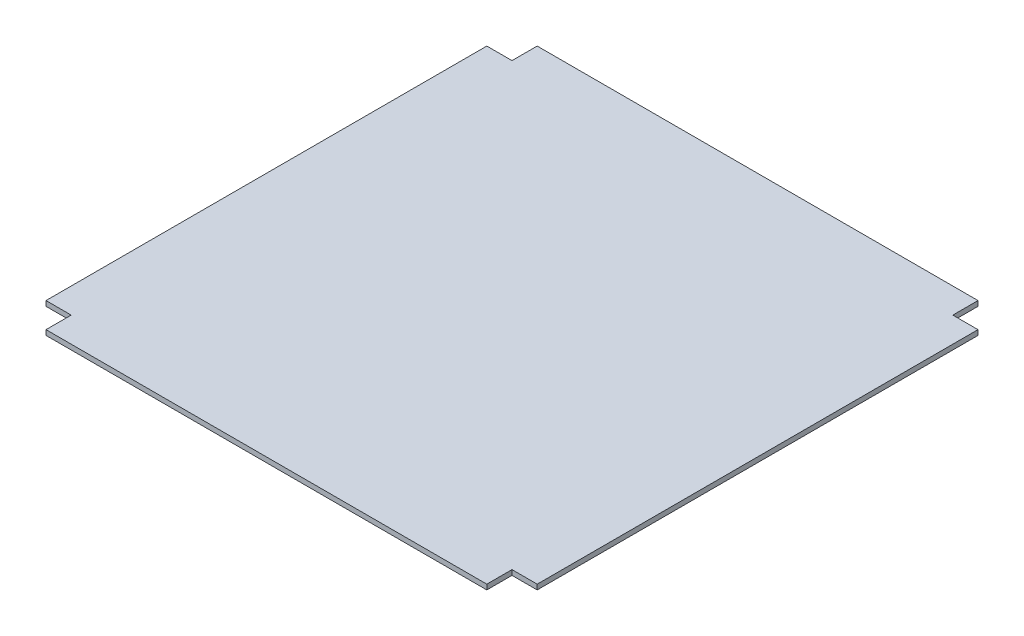
ISO-10303-21;
HEADER;
FILE_DESCRIPTION(('STEP AP214'),'2;1');
FILE_NAME('part.step','',(''),(''),'','','');
FILE_SCHEMA(('AUTOMOTIVE_DESIGN { 1 0 10303 214 1 1 1 1 }'));
ENDSEC;
DATA;
#1=APPLICATION_CONTEXT('core data for automotive mechanical design processes');
#2=APPLICATION_PROTOCOL_DEFINITION('international standard','automotive_design',2000,#1);
#3=PRODUCT_CONTEXT('',#1,'mechanical');
#4=PRODUCT('Part','Part','',(#3));
#5=PRODUCT_RELATED_PRODUCT_CATEGORY('part','',(#4));
#6=PRODUCT_DEFINITION_FORMATION('','',#4);
#7=PRODUCT_DEFINITION_CONTEXT('part definition',#1,'design');
#8=PRODUCT_DEFINITION('design','',#6,#7);
#9=PRODUCT_DEFINITION_SHAPE('','',#8);
#10=(LENGTH_UNIT() NAMED_UNIT(*) SI_UNIT(.MILLI.,.METRE.));
#11=(NAMED_UNIT(*) PLANE_ANGLE_UNIT() SI_UNIT($,.RADIAN.));
#12=(NAMED_UNIT(*) SI_UNIT($,.STERADIAN.) SOLID_ANGLE_UNIT());
#13=UNCERTAINTY_MEASURE_WITH_UNIT(LENGTH_MEASURE(1.E-05),#10,'distance_accuracy_value','');
#14=(GEOMETRIC_REPRESENTATION_CONTEXT(3) GLOBAL_UNCERTAINTY_ASSIGNED_CONTEXT((#13)) GLOBAL_UNIT_ASSIGNED_CONTEXT((#10,
#11,#12)) REPRESENTATION_CONTEXT('',''));
#15=CARTESIAN_POINT('',(0.,0.,0.));
#16=DIRECTION('',(0.,0.,1.));
#17=DIRECTION('',(1.,0.,0.));
#18=AXIS2_PLACEMENT_3D('',#15,#16,#17);
#19=CARTESIAN_POINT('',(-195.,4.,195.));
#20=DIRECTION('',(1.,0.,0.));
#21=DIRECTION('',(0.,0.,-1.));
#22=AXIS2_PLACEMENT_3D('',#19,#20,#21);
#23=PLANE('',#22);
#24=DIRECTION('',(0.,0.,1.));
#25=VECTOR('',#24,1.);
#26=CARTESIAN_POINT('',(-195.,0.,195.));
#27=LINE('',#26,#25);
#28=CARTESIAN_POINT('',(-195.,0.,-175.));
#29=VERTEX_POINT('',#28);
#30=CARTESIAN_POINT('',(-195.,0.,175.));
#31=VERTEX_POINT('',#30);
#32=EDGE_CURVE('E158',#29,#31,#27,.T.);
#33=ORIENTED_EDGE('',*,*,#32,.T.);
#34=DIRECTION('',(0.,1.,0.));
#35=VECTOR('',#34,1.);
#36=CARTESIAN_POINT('',(-195.,-6.,175.));
#37=LINE('',#36,#35);
#38=CARTESIAN_POINT('',(-195.,4.,175.));
#39=VERTEX_POINT('',#38);
#40=EDGE_CURVE('E197',#31,#39,#37,.T.);
#41=ORIENTED_EDGE('',*,*,#40,.T.);
#42=DIRECTION('',(0.,0.,1.));
#43=VECTOR('',#42,1.);
#44=CARTESIAN_POINT('',(-195.,4.,195.));
#45=LINE('',#44,#43);
#46=CARTESIAN_POINT('',(-195.,4.,-175.));
#47=VERTEX_POINT('',#46);
#48=EDGE_CURVE('E168',#47,#39,#45,.T.);
#49=ORIENTED_EDGE('',*,*,#48,.F.);
#50=DIRECTION('',(0.,1.,0.));
#51=VECTOR('',#50,1.);
#52=CARTESIAN_POINT('',(-195.,-6.,-175.));
#53=LINE('',#52,#51);
#54=EDGE_CURVE('E209',#29,#47,#53,.T.);
#55=ORIENTED_EDGE('',*,*,#54,.F.);
#56=EDGE_LOOP('',(#33,#41,#49,#55));
#57=FACE_BOUND('',#56,.T.);
#58=ADVANCED_FACE('F34',(#57),#23,.F.);
#59=CARTESIAN_POINT('',(195.,4.,195.));
#60=DIRECTION('',(0.,0.,-1.));
#61=DIRECTION('',(-1.,0.,0.));
#62=AXIS2_PLACEMENT_3D('',#59,#60,#61);
#63=PLANE('',#62);
#64=DIRECTION('',(1.,0.,0.));
#65=VECTOR('',#64,1.);
#66=CARTESIAN_POINT('',(195.,4.,195.));
#67=LINE('',#66,#65);
#68=CARTESIAN_POINT('',(-175.,4.,195.));
#69=VERTEX_POINT('',#68);
#70=CARTESIAN_POINT('',(175.,4.,195.));
#71=VERTEX_POINT('',#70);
#72=EDGE_CURVE('E154',#69,#71,#67,.T.);
#73=ORIENTED_EDGE('',*,*,#72,.F.);
#74=DIRECTION('',(0.,1.,0.));
#75=VECTOR('',#74,1.);
#76=CARTESIAN_POINT('',(-175.,-6.,195.));
#77=LINE('',#76,#75);
#78=CARTESIAN_POINT('',(-175.,0.,195.));
#79=VERTEX_POINT('',#78);
#80=EDGE_CURVE('E188',#79,#69,#77,.T.);
#81=ORIENTED_EDGE('',*,*,#80,.F.);
#82=DIRECTION('',(1.,0.,0.));
#83=VECTOR('',#82,1.);
#84=CARTESIAN_POINT('',(195.,0.,195.));
#85=LINE('',#84,#83);
#86=CARTESIAN_POINT('',(175.,0.,195.));
#87=VERTEX_POINT('',#86);
#88=EDGE_CURVE('E161',#79,#87,#85,.T.);
#89=ORIENTED_EDGE('',*,*,#88,.T.);
#90=DIRECTION('',(0.,1.,0.));
#91=VECTOR('',#90,1.);
#92=CARTESIAN_POINT('',(175.,-6.,195.));
#93=LINE('',#92,#91);
#94=EDGE_CURVE('E143',#87,#71,#93,.T.);
#95=ORIENTED_EDGE('',*,*,#94,.T.);
#96=EDGE_LOOP('',(#73,#81,#89,#95));
#97=FACE_BOUND('',#96,.T.);
#98=ADVANCED_FACE('F192',(#97),#63,.F.);
#99=CARTESIAN_POINT('',(195.,4.,195.));
#100=DIRECTION('',(-1.,0.,0.));
#101=DIRECTION('',(0.,0.,1.));
#102=AXIS2_PLACEMENT_3D('',#99,#100,#101);
#103=PLANE('',#102);
#104=DIRECTION('',(0.,0.,-1.));
#105=VECTOR('',#104,1.);
#106=CARTESIAN_POINT('',(195.,4.,195.));
#107=LINE('',#106,#105);
#108=CARTESIAN_POINT('',(195.,4.,175.));
#109=VERTEX_POINT('',#108);
#110=CARTESIAN_POINT('',(195.,4.,-175.));
#111=VERTEX_POINT('',#110);
#112=EDGE_CURVE('E149',#109,#111,#107,.T.);
#113=ORIENTED_EDGE('',*,*,#112,.F.);
#114=DIRECTION('',(0.,1.,0.));
#115=VECTOR('',#114,1.);
#116=CARTESIAN_POINT('',(195.,-6.,175.));
#117=LINE('',#116,#115);
#118=CARTESIAN_POINT('',(195.,0.,175.));
#119=VERTEX_POINT('',#118);
#120=EDGE_CURVE('E220',#119,#109,#117,.T.);
#121=ORIENTED_EDGE('',*,*,#120,.F.);
#122=DIRECTION('',(0.,0.,-1.));
#123=VECTOR('',#122,1.);
#124=CARTESIAN_POINT('',(195.,0.,195.));
#125=LINE('',#124,#123);
#126=CARTESIAN_POINT('',(195.,0.,-175.));
#127=VERTEX_POINT('',#126);
#128=EDGE_CURVE('E164',#119,#127,#125,.T.);
#129=ORIENTED_EDGE('',*,*,#128,.T.);
#130=DIRECTION('',(0.,1.,0.));
#131=VECTOR('',#130,1.);
#132=CARTESIAN_POINT('',(195.,-6.,-175.));
#133=LINE('',#132,#131);
#134=EDGE_CURVE('E207',#127,#111,#133,.T.);
#135=ORIENTED_EDGE('',*,*,#134,.T.);
#136=EDGE_LOOP('',(#113,#121,#129,#135));
#137=FACE_BOUND('',#136,.T.);
#138=ADVANCED_FACE('F237',(#137),#103,.F.);
#139=CARTESIAN_POINT('',(195.,4.,-195.));
#140=DIRECTION('',(0.,0.,1.));
#141=DIRECTION('',(1.,0.,0.));
#142=AXIS2_PLACEMENT_3D('',#139,#140,#141);
#143=PLANE('',#142);
#144=DIRECTION('',(-1.,0.,0.));
#145=VECTOR('',#144,1.);
#146=CARTESIAN_POINT('',(195.,4.,-195.));
#147=LINE('',#146,#145);
#148=CARTESIAN_POINT('',(175.,4.,-195.));
#149=VERTEX_POINT('',#148);
#150=CARTESIAN_POINT('',(-175.,4.,-195.));
#151=VERTEX_POINT('',#150);
#152=EDGE_CURVE('E141',#149,#151,#147,.T.);
#153=ORIENTED_EDGE('',*,*,#152,.F.);
#154=DIRECTION('',(0.,1.,0.));
#155=VECTOR('',#154,1.);
#156=CARTESIAN_POINT('',(175.,-6.,-195.));
#157=LINE('',#156,#155);
#158=CARTESIAN_POINT('',(175.,0.,-195.));
#159=VERTEX_POINT('',#158);
#160=EDGE_CURVE('E122',#159,#149,#157,.T.);
#161=ORIENTED_EDGE('',*,*,#160,.F.);
#162=DIRECTION('',(-1.,0.,0.));
#163=VECTOR('',#162,1.);
#164=CARTESIAN_POINT('',(195.,0.,-195.));
#165=LINE('',#164,#163);
#166=CARTESIAN_POINT('',(-175.,0.,-195.));
#167=VERTEX_POINT('',#166);
#168=EDGE_CURVE('E167',#159,#167,#165,.T.);
#169=ORIENTED_EDGE('',*,*,#168,.T.);
#170=DIRECTION('',(0.,1.,0.));
#171=VECTOR('',#170,1.);
#172=CARTESIAN_POINT('',(-175.,-6.,-195.));
#173=LINE('',#172,#171);
#174=EDGE_CURVE('E147',#167,#151,#173,.T.);
#175=ORIENTED_EDGE('',*,*,#174,.T.);
#176=EDGE_LOOP('',(#153,#161,#169,#175));
#177=FACE_BOUND('',#176,.T.);
#178=ADVANCED_FACE('F146',(#177),#143,.F.);
#179=CARTESIAN_POINT('',(0.,4.,0.));
#180=DIRECTION('',(0.,1.,0.));
#181=DIRECTION('',(0.,0.,1.));
#182=AXIS2_PLACEMENT_3D('',#179,#180,#181);
#183=PLANE('',#182);
#184=DIRECTION('',(-1.,0.,0.));
#185=VECTOR('',#184,1.);
#186=CARTESIAN_POINT('',(-195.,4.,175.));
#187=LINE('',#186,#185);
#188=CARTESIAN_POINT('',(-175.,4.,175.));
#189=VERTEX_POINT('',#188);
#190=EDGE_CURVE('E195',#189,#39,#187,.T.);
#191=ORIENTED_EDGE('',*,*,#190,.F.);
#192=DIRECTION('',(0.,0.,-1.));
#193=VECTOR('',#192,1.);
#194=CARTESIAN_POINT('',(-175.,4.,195.));
#195=LINE('',#194,#193);
#196=EDGE_CURVE('E199',#69,#189,#195,.T.);
#197=ORIENTED_EDGE('',*,*,#196,.F.);
#198=ORIENTED_EDGE('',*,*,#72,.T.);
#199=DIRECTION('',(0.,0.,1.));
#200=VECTOR('',#199,1.);
#201=CARTESIAN_POINT('',(175.,4.,195.));
#202=LINE('',#201,#200);
#203=CARTESIAN_POINT('',(175.,4.,175.));
#204=VERTEX_POINT('',#203);
#205=EDGE_CURVE('E217',#204,#71,#202,.T.);
#206=ORIENTED_EDGE('',*,*,#205,.F.);
#207=DIRECTION('',(-1.,0.,0.));
#208=VECTOR('',#207,1.);
#209=CARTESIAN_POINT('',(195.,4.,175.));
#210=LINE('',#209,#208);
#211=EDGE_CURVE('E223',#109,#204,#210,.T.);
#212=ORIENTED_EDGE('',*,*,#211,.F.);
#213=ORIENTED_EDGE('',*,*,#112,.T.);
#214=DIRECTION('',(1.,0.,0.));
#215=VECTOR('',#214,1.);
#216=CARTESIAN_POINT('',(195.,4.,-175.));
#217=LINE('',#216,#215);
#218=CARTESIAN_POINT('',(175.,4.,-175.));
#219=VERTEX_POINT('',#218);
#220=EDGE_CURVE('E134',#219,#111,#217,.T.);
#221=ORIENTED_EDGE('',*,*,#220,.F.);
#222=DIRECTION('',(0.,0.,1.));
#223=VECTOR('',#222,1.);
#224=CARTESIAN_POINT('',(175.,4.,-195.));
#225=LINE('',#224,#223);
#226=EDGE_CURVE('E125',#149,#219,#225,.T.);
#227=ORIENTED_EDGE('',*,*,#226,.F.);
#228=ORIENTED_EDGE('',*,*,#152,.T.);
#229=DIRECTION('',(0.,0.,-1.));
#230=VECTOR('',#229,1.);
#231=CARTESIAN_POINT('',(-175.,4.,-195.));
#232=LINE('',#231,#230);
#233=CARTESIAN_POINT('',(-175.,4.,-175.));
#234=VERTEX_POINT('',#233);
#235=EDGE_CURVE('E206',#234,#151,#232,.T.);
#236=ORIENTED_EDGE('',*,*,#235,.F.);
#237=DIRECTION('',(1.,0.,0.));
#238=VECTOR('',#237,1.);
#239=CARTESIAN_POINT('',(-195.,4.,-175.));
#240=LINE('',#239,#238);
#241=EDGE_CURVE('E203',#47,#234,#240,.T.);
#242=ORIENTED_EDGE('',*,*,#241,.F.);
#243=ORIENTED_EDGE('',*,*,#48,.T.);
#244=EDGE_LOOP('',(#191,#197,#198,#206,#212,#213,#221,#227,#228,#236,#242,#243));
#245=FACE_BOUND('',#244,.T.);
#246=ADVANCED_FACE('F139',(#245),#183,.T.);
#247=CARTESIAN_POINT('',(0.,0.,0.));
#248=DIRECTION('',(0.,1.,0.));
#249=DIRECTION('',(0.,0.,1.));
#250=AXIS2_PLACEMENT_3D('',#247,#248,#249);
#251=PLANE('',#250);
#252=DIRECTION('',(0.,0.,-1.));
#253=VECTOR('',#252,1.);
#254=CARTESIAN_POINT('',(-175.,0.,0.));
#255=LINE('',#254,#253);
#256=CARTESIAN_POINT('',(-175.,0.,175.));
#257=VERTEX_POINT('',#256);
#258=EDGE_CURVE('E41',#79,#257,#255,.T.);
#259=ORIENTED_EDGE('',*,*,#258,.T.);
#260=DIRECTION('',(-1.,0.,0.));
#261=VECTOR('',#260,1.);
#262=CARTESIAN_POINT('',(0.,0.,175.));
#263=LINE('',#262,#261);
#264=EDGE_CURVE('E11',#257,#31,#263,.T.);
#265=ORIENTED_EDGE('',*,*,#264,.T.);
#266=ORIENTED_EDGE('',*,*,#32,.F.);
#267=DIRECTION('',(1.,0.,0.));
#268=VECTOR('',#267,1.);
#269=CARTESIAN_POINT('',(0.,0.,-175.));
#270=LINE('',#269,#268);
#271=CARTESIAN_POINT('',(-175.,0.,-175.));
#272=VERTEX_POINT('',#271);
#273=EDGE_CURVE('E148',#29,#272,#270,.T.);
#274=ORIENTED_EDGE('',*,*,#273,.T.);
#275=DIRECTION('',(0.,0.,-1.));
#276=VECTOR('',#275,1.);
#277=CARTESIAN_POINT('',(-175.,0.,0.));
#278=LINE('',#277,#276);
#279=EDGE_CURVE('E152',#272,#167,#278,.T.);
#280=ORIENTED_EDGE('',*,*,#279,.T.);
#281=ORIENTED_EDGE('',*,*,#168,.F.);
#282=DIRECTION('',(0.,0.,1.));
#283=VECTOR('',#282,1.);
#284=CARTESIAN_POINT('',(175.,0.,0.));
#285=LINE('',#284,#283);
#286=CARTESIAN_POINT('',(175.,0.,-175.));
#287=VERTEX_POINT('',#286);
#288=EDGE_CURVE('E128',#159,#287,#285,.T.);
#289=ORIENTED_EDGE('',*,*,#288,.T.);
#290=DIRECTION('',(1.,0.,0.));
#291=VECTOR('',#290,1.);
#292=CARTESIAN_POINT('',(0.,0.,-175.));
#293=LINE('',#292,#291);
#294=EDGE_CURVE('E173',#287,#127,#293,.T.);
#295=ORIENTED_EDGE('',*,*,#294,.T.);
#296=ORIENTED_EDGE('',*,*,#128,.F.);
#297=DIRECTION('',(-1.,0.,0.));
#298=VECTOR('',#297,1.);
#299=CARTESIAN_POINT('',(0.,0.,175.));
#300=LINE('',#299,#298);
#301=CARTESIAN_POINT('',(175.,0.,175.));
#302=VERTEX_POINT('',#301);
#303=EDGE_CURVE('E176',#119,#302,#300,.T.);
#304=ORIENTED_EDGE('',*,*,#303,.T.);
#305=DIRECTION('',(0.,0.,1.));
#306=VECTOR('',#305,1.);
#307=CARTESIAN_POINT('',(175.,0.,0.));
#308=LINE('',#307,#306);
#309=EDGE_CURVE('E179',#302,#87,#308,.T.);
#310=ORIENTED_EDGE('',*,*,#309,.T.);
#311=ORIENTED_EDGE('',*,*,#88,.F.);
#312=EDGE_LOOP('',(#259,#265,#266,#274,#280,#281,#289,#295,#296,#304,#310,#311));
#313=FACE_BOUND('',#312,.T.);
#314=ADVANCED_FACE('F184',(#313),#251,.F.);
#315=CARTESIAN_POINT('',(-175.,-6.,-195.));
#316=DIRECTION('',(1.,0.,0.));
#317=DIRECTION('',(0.,0.,-1.));
#318=AXIS2_PLACEMENT_3D('',#315,#316,#317);
#319=PLANE('',#318);
#320=DIRECTION('',(0.,1.,0.));
#321=VECTOR('',#320,1.);
#322=CARTESIAN_POINT('',(-175.,-6.,-175.));
#323=LINE('',#322,#321);
#324=EDGE_CURVE('E211',#272,#234,#323,.T.);
#325=ORIENTED_EDGE('',*,*,#324,.T.);
#326=ORIENTED_EDGE('',*,*,#235,.T.);
#327=ORIENTED_EDGE('',*,*,#174,.F.);
#328=ORIENTED_EDGE('',*,*,#279,.F.);
#329=EDGE_LOOP('',(#325,#326,#327,#328));
#330=FACE_BOUND('',#329,.T.);
#331=ADVANCED_FACE('F245',(#330),#319,.F.);
#332=CARTESIAN_POINT('',(-195.,-6.,-175.));
#333=DIRECTION('',(0.,0.,1.));
#334=DIRECTION('',(1.,0.,0.));
#335=AXIS2_PLACEMENT_3D('',#332,#333,#334);
#336=PLANE('',#335);
#337=ORIENTED_EDGE('',*,*,#54,.T.);
#338=ORIENTED_EDGE('',*,*,#241,.T.);
#339=ORIENTED_EDGE('',*,*,#324,.F.);
#340=ORIENTED_EDGE('',*,*,#273,.F.);
#341=EDGE_LOOP('',(#337,#338,#339,#340));
#342=FACE_BOUND('',#341,.T.);
#343=ADVANCED_FACE('F249',(#342),#336,.F.);
#344=CARTESIAN_POINT('',(195.,-6.,-175.));
#345=DIRECTION('',(0.,0.,1.));
#346=DIRECTION('',(1.,0.,0.));
#347=AXIS2_PLACEMENT_3D('',#344,#345,#346);
#348=PLANE('',#347);
#349=DIRECTION('',(0.,1.,0.));
#350=VECTOR('',#349,1.);
#351=CARTESIAN_POINT('',(175.,-6.,-175.));
#352=LINE('',#351,#350);
#353=EDGE_CURVE('E133',#287,#219,#352,.T.);
#354=ORIENTED_EDGE('',*,*,#353,.T.);
#355=ORIENTED_EDGE('',*,*,#220,.T.);
#356=ORIENTED_EDGE('',*,*,#134,.F.);
#357=ORIENTED_EDGE('',*,*,#294,.F.);
#358=EDGE_LOOP('',(#354,#355,#356,#357));
#359=FACE_BOUND('',#358,.T.);
#360=ADVANCED_FACE('F242',(#359),#348,.F.);
#361=CARTESIAN_POINT('',(175.,-6.,-195.));
#362=DIRECTION('',(-1.,0.,0.));
#363=DIRECTION('',(0.,0.,1.));
#364=AXIS2_PLACEMENT_3D('',#361,#362,#363);
#365=PLANE('',#364);
#366=ORIENTED_EDGE('',*,*,#160,.T.);
#367=ORIENTED_EDGE('',*,*,#226,.T.);
#368=ORIENTED_EDGE('',*,*,#353,.F.);
#369=ORIENTED_EDGE('',*,*,#288,.F.);
#370=EDGE_LOOP('',(#366,#367,#368,#369));
#371=FACE_BOUND('',#370,.T.);
#372=ADVANCED_FACE('F124',(#371),#365,.F.);
#373=CARTESIAN_POINT('',(175.,-6.,195.));
#374=DIRECTION('',(-1.,0.,0.));
#375=DIRECTION('',(0.,0.,1.));
#376=AXIS2_PLACEMENT_3D('',#373,#374,#375);
#377=PLANE('',#376);
#378=DIRECTION('',(0.,1.,0.));
#379=VECTOR('',#378,1.);
#380=CARTESIAN_POINT('',(175.,-6.,175.));
#381=LINE('',#380,#379);
#382=EDGE_CURVE('E56',#302,#204,#381,.T.);
#383=ORIENTED_EDGE('',*,*,#382,.T.);
#384=ORIENTED_EDGE('',*,*,#205,.T.);
#385=ORIENTED_EDGE('',*,*,#94,.F.);
#386=ORIENTED_EDGE('',*,*,#309,.F.);
#387=EDGE_LOOP('',(#383,#384,#385,#386));
#388=FACE_BOUND('',#387,.T.);
#389=ADVANCED_FACE('F303',(#388),#377,.F.);
#390=CARTESIAN_POINT('',(195.,-6.,175.));
#391=DIRECTION('',(0.,0.,-1.));
#392=DIRECTION('',(-1.,0.,0.));
#393=AXIS2_PLACEMENT_3D('',#390,#391,#392);
#394=PLANE('',#393);
#395=ORIENTED_EDGE('',*,*,#120,.T.);
#396=ORIENTED_EDGE('',*,*,#211,.T.);
#397=ORIENTED_EDGE('',*,*,#382,.F.);
#398=ORIENTED_EDGE('',*,*,#303,.F.);
#399=EDGE_LOOP('',(#395,#396,#397,#398));
#400=FACE_BOUND('',#399,.T.);
#401=ADVANCED_FACE('F232',(#400),#394,.F.);
#402=CARTESIAN_POINT('',(-195.,-6.,175.));
#403=DIRECTION('',(0.,0.,-1.));
#404=DIRECTION('',(-1.,0.,0.));
#405=AXIS2_PLACEMENT_3D('',#402,#403,#404);
#406=PLANE('',#405);
#407=DIRECTION('',(0.,1.,0.));
#408=VECTOR('',#407,1.);
#409=CARTESIAN_POINT('',(-175.,-6.,175.));
#410=LINE('',#409,#408);
#411=EDGE_CURVE('E48',#257,#189,#410,.T.);
#412=ORIENTED_EDGE('',*,*,#411,.T.);
#413=ORIENTED_EDGE('',*,*,#190,.T.);
#414=ORIENTED_EDGE('',*,*,#40,.F.);
#415=ORIENTED_EDGE('',*,*,#264,.F.);
#416=EDGE_LOOP('',(#412,#413,#414,#415));
#417=FACE_BOUND('',#416,.T.);
#418=ADVANCED_FACE('F320',(#417),#406,.F.);
#419=CARTESIAN_POINT('',(-175.,-6.,195.));
#420=DIRECTION('',(1.,0.,0.));
#421=DIRECTION('',(0.,0.,-1.));
#422=AXIS2_PLACEMENT_3D('',#419,#420,#421);
#423=PLANE('',#422);
#424=ORIENTED_EDGE('',*,*,#80,.T.);
#425=ORIENTED_EDGE('',*,*,#196,.T.);
#426=ORIENTED_EDGE('',*,*,#411,.F.);
#427=ORIENTED_EDGE('',*,*,#258,.F.);
#428=EDGE_LOOP('',(#424,#425,#426,#427));
#429=FACE_BOUND('',#428,.T.);
#430=ADVANCED_FACE('F187',(#429),#423,.F.);
#431=CLOSED_SHELL('',(#58,#98,#138,#178,#246,#314,#331,#343,#360,#372,#389,#401,#418,#430));
#432=MANIFOLD_SOLID_BREP('B2',#431);
#433=ADVANCED_BREP_SHAPE_REPRESENTATION('',(#18,#432),#14);
#434=SHAPE_DEFINITION_REPRESENTATION(#9,#433);
ENDSEC;
END-ISO-10303-21;
